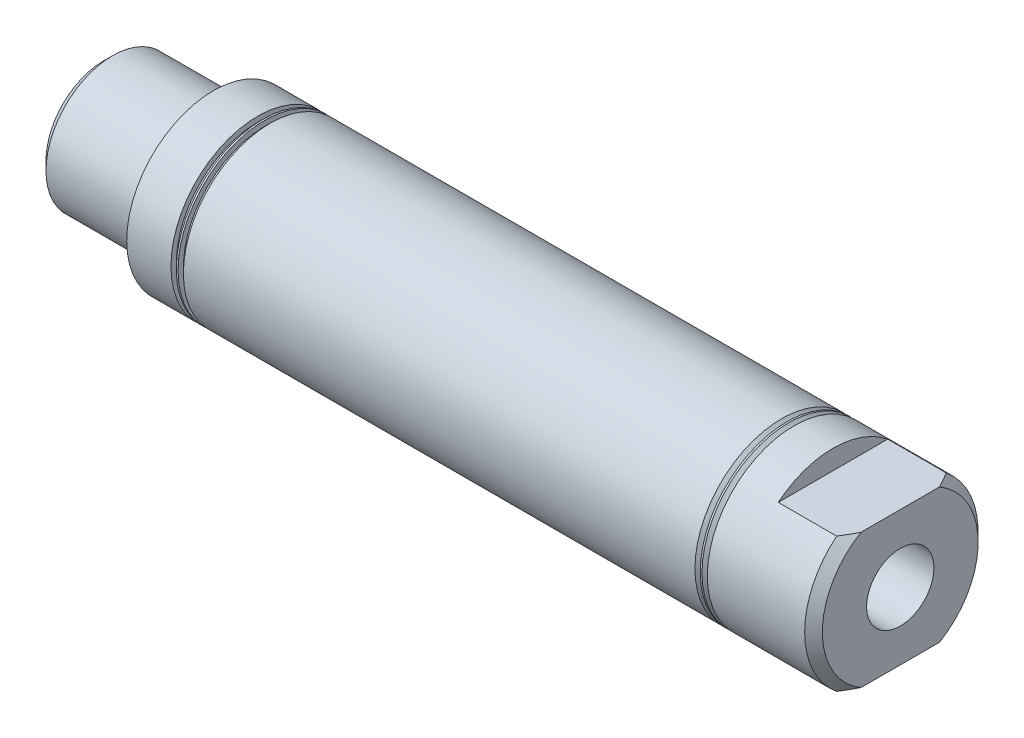
ISO-10303-21;
HEADER;
FILE_DESCRIPTION(('STEP AP214'),'2;1');
FILE_NAME('part.step','',(''),(''),'','','');
FILE_SCHEMA(('AUTOMOTIVE_DESIGN { 1 0 10303 214 1 1 1 1 }'));
ENDSEC;
DATA;
#1=APPLICATION_CONTEXT('core data for automotive mechanical design processes');
#2=APPLICATION_PROTOCOL_DEFINITION('international standard','automotive_design',2000,#1);
#3=PRODUCT_CONTEXT('',#1,'mechanical');
#4=PRODUCT('Part','Part','',(#3));
#5=PRODUCT_RELATED_PRODUCT_CATEGORY('part','',(#4));
#6=PRODUCT_DEFINITION_FORMATION('','',#4);
#7=PRODUCT_DEFINITION_CONTEXT('part definition',#1,'design');
#8=PRODUCT_DEFINITION('design','',#6,#7);
#9=PRODUCT_DEFINITION_SHAPE('','',#8);
#10=(LENGTH_UNIT() NAMED_UNIT(*) SI_UNIT(.MILLI.,.METRE.));
#11=(NAMED_UNIT(*) PLANE_ANGLE_UNIT() SI_UNIT($,.RADIAN.));
#12=(NAMED_UNIT(*) SI_UNIT($,.STERADIAN.) SOLID_ANGLE_UNIT());
#13=UNCERTAINTY_MEASURE_WITH_UNIT(LENGTH_MEASURE(1.E-05),#10,'distance_accuracy_value','');
#14=(GEOMETRIC_REPRESENTATION_CONTEXT(3) GLOBAL_UNCERTAINTY_ASSIGNED_CONTEXT((#13)) GLOBAL_UNIT_ASSIGNED_CONTEXT((#10,
#11,#12)) REPRESENTATION_CONTEXT('',''));
#15=CARTESIAN_POINT('',(0.,0.,0.));
#16=DIRECTION('',(0.,0.,1.));
#17=DIRECTION('',(1.,0.,0.));
#18=AXIS2_PLACEMENT_3D('',#15,#16,#17);
#19=CARTESIAN_POINT('',(0.,0.,0.));
#20=DIRECTION('',(1.,0.,0.));
#21=DIRECTION('',(0.,0.,-1.));
#22=AXIS2_PLACEMENT_3D('',#19,#20,#21);
#23=CYLINDRICAL_SURFACE('',#22,5.55625);
#24=CARTESIAN_POINT('',(19.812,0.,0.));
#25=DIRECTION('',(1.,0.,0.));
#26=DIRECTION('',(0.,0.,-1.));
#27=AXIS2_PLACEMENT_3D('',#24,#25,#26);
#28=CIRCLE('',#27,5.55625);
#29=CARTESIAN_POINT('',(19.812,0.,-5.55625));
#30=VERTEX_POINT('',#29);
#31=EDGE_CURVE('E219',#30,#30,#28,.F.);
#32=ORIENTED_EDGE('',*,*,#31,.T.);
#33=EDGE_LOOP('',(#32));
#34=FACE_BOUND('',#33,.T.);
#35=CARTESIAN_POINT('',(45.212,0.,0.));
#36=DIRECTION('',(1.,0.,0.));
#37=DIRECTION('',(0.,0.,-1.));
#38=AXIS2_PLACEMENT_3D('',#35,#36,#37);
#39=CIRCLE('',#38,5.55625);
#40=CARTESIAN_POINT('',(45.212,0.,-5.55625));
#41=VERTEX_POINT('',#40);
#42=EDGE_CURVE('E21',#41,#41,#39,.T.);
#43=ORIENTED_EDGE('',*,*,#42,.T.);
#44=EDGE_LOOP('',(#43));
#45=FACE_BOUND('',#44,.T.);
#46=ADVANCED_FACE('F18',(#34,#45),#23,.F.);
#47=CARTESIAN_POINT('',(45.212,0.,0.));
#48=DIRECTION('',(1.,0.,0.));
#49=DIRECTION('',(0.,0.,-1.));
#50=AXIS2_PLACEMENT_3D('',#47,#48,#49);
#51=PLANE('',#50);
#52=ORIENTED_EDGE('',*,*,#42,.F.);
#53=EDGE_LOOP('',(#52));
#54=FACE_BOUND('',#53,.T.);
#55=CARTESIAN_POINT('',(45.212,0.,0.));
#56=DIRECTION('',(1.,0.,0.));
#57=DIRECTION('',(0.,0.,-1.));
#58=AXIS2_PLACEMENT_3D('',#55,#56,#57);
#59=CIRCLE('',#58,2.0193);
#60=CARTESIAN_POINT('',(45.212,0.,-2.0193));
#61=VERTEX_POINT('',#60);
#62=EDGE_CURVE('E217',#61,#61,#59,.T.);
#63=ORIENTED_EDGE('',*,*,#62,.T.);
#64=EDGE_LOOP('',(#63));
#65=FACE_BOUND('',#64,.T.);
#66=ADVANCED_FACE('F227',(#54,#65),#51,.F.);
#67=CARTESIAN_POINT('',(19.812,5.55625,0.));
#68=DIRECTION('',(-1.,0.,0.));
#69=DIRECTION('',(0.,0.,1.));
#70=AXIS2_PLACEMENT_3D('',#67,#68,#69);
#71=PLANE('',#70);
#72=ORIENTED_EDGE('',*,*,#31,.F.);
#73=EDGE_LOOP('',(#72));
#74=FACE_BOUND('',#73,.T.);
#75=CARTESIAN_POINT('',(19.812,0.,0.));
#76=DIRECTION('',(1.,0.,0.));
#77=DIRECTION('',(0.,0.,-1.));
#78=AXIS2_PLACEMENT_3D('',#75,#76,#77);
#79=CIRCLE('',#78,2.3749);
#80=CARTESIAN_POINT('',(19.812,0.,-2.3749));
#81=VERTEX_POINT('',#80);
#82=EDGE_CURVE('E214',#81,#81,#79,.F.);
#83=ORIENTED_EDGE('',*,*,#82,.T.);
#84=EDGE_LOOP('',(#83));
#85=FACE_BOUND('',#84,.T.);
#86=ADVANCED_FACE('F230',(#74,#85),#71,.F.);
#87=CARTESIAN_POINT('',(57.15,0.,0.));
#88=DIRECTION('',(1.,0.,0.));
#89=DIRECTION('',(0.,0.,-1.));
#90=AXIS2_PLACEMENT_3D('',#87,#88,#89);
#91=CYLINDRICAL_SURFACE('',#90,2.0193);
#92=ORIENTED_EDGE('',*,*,#62,.F.);
#93=EDGE_LOOP('',(#92));
#94=FACE_BOUND('',#93,.T.);
#95=CARTESIAN_POINT('',(47.498,0.,0.));
#96=DIRECTION('',(1.,0.,0.));
#97=DIRECTION('',(0.,0.,-1.));
#98=AXIS2_PLACEMENT_3D('',#95,#96,#97);
#99=CIRCLE('',#98,2.0193);
#100=CARTESIAN_POINT('',(47.498,0.,-2.0193));
#101=VERTEX_POINT('',#100);
#102=EDGE_CURVE('E211',#101,#101,#99,.T.);
#103=ORIENTED_EDGE('',*,*,#102,.T.);
#104=EDGE_LOOP('',(#103));
#105=FACE_BOUND('',#104,.T.);
#106=ADVANCED_FACE('F233',(#94,#105),#91,.F.);
#107=CARTESIAN_POINT('',(0.,0.,0.));
#108=DIRECTION('',(1.,0.,0.));
#109=DIRECTION('',(0.,0.,-1.));
#110=AXIS2_PLACEMENT_3D('',#107,#108,#109);
#111=CYLINDRICAL_SURFACE('',#110,2.3749);
#112=CARTESIAN_POINT('',(0.,0.,0.));
#113=DIRECTION('',(1.,0.,0.));
#114=DIRECTION('',(0.,0.,-1.));
#115=AXIS2_PLACEMENT_3D('',#112,#113,#114);
#116=CIRCLE('',#115,2.3749);
#117=CARTESIAN_POINT('',(0.,0.,-2.3749));
#118=VERTEX_POINT('',#117);
#119=EDGE_CURVE('E208',#118,#118,#116,.F.);
#120=ORIENTED_EDGE('',*,*,#119,.T.);
#121=EDGE_LOOP('',(#120));
#122=FACE_BOUND('',#121,.T.);
#123=ORIENTED_EDGE('',*,*,#82,.F.);
#124=EDGE_LOOP('',(#123));
#125=FACE_BOUND('',#124,.T.);
#126=ADVANCED_FACE('F236',(#122,#125),#111,.F.);
#127=CARTESIAN_POINT('',(47.498,0.,2.0193));
#128=DIRECTION('',(-1.,0.,0.));
#129=DIRECTION('',(0.,0.,1.));
#130=AXIS2_PLACEMENT_3D('',#127,#128,#129);
#131=PLANE('',#130);
#132=CARTESIAN_POINT('',(47.498,0.,0.));
#133=DIRECTION('',(1.,0.,0.));
#134=DIRECTION('',(0.,0.,-1.));
#135=AXIS2_PLACEMENT_3D('',#132,#133,#134);
#136=CIRCLE('',#135,2.413);
#137=CARTESIAN_POINT('',(47.498,0.,-2.413));
#138=VERTEX_POINT('',#137);
#139=EDGE_CURVE('E205',#138,#138,#136,.T.);
#140=ORIENTED_EDGE('',*,*,#139,.T.);
#141=EDGE_LOOP('',(#140));
#142=FACE_BOUND('',#141,.T.);
#143=ORIENTED_EDGE('',*,*,#102,.F.);
#144=EDGE_LOOP('',(#143));
#145=FACE_BOUND('',#144,.T.);
#146=ADVANCED_FACE('F240',(#142,#145),#131,.F.);
#147=CARTESIAN_POINT('',(0.,4.7752,0.));
#148=DIRECTION('',(1.,0.,0.));
#149=DIRECTION('',(0.,0.,-1.));
#150=AXIS2_PLACEMENT_3D('',#147,#148,#149);
#151=PLANE('',#150);
#152=ORIENTED_EDGE('',*,*,#119,.F.);
#153=EDGE_LOOP('',(#152));
#154=FACE_BOUND('',#153,.T.);
#155=CARTESIAN_POINT('',(0.,0.,0.));
#156=DIRECTION('',(1.,0.,0.));
#157=DIRECTION('',(0.,0.,-1.));
#158=AXIS2_PLACEMENT_3D('',#155,#156,#157);
#159=CIRCLE('',#158,4.14019999999482);
#160=CARTESIAN_POINT('',(0.,0.,-4.14019999999482));
#161=VERTEX_POINT('',#160);
#162=EDGE_CURVE('E202',#161,#161,#159,.T.);
#163=ORIENTED_EDGE('',*,*,#162,.F.);
#164=EDGE_LOOP('',(#163));
#165=FACE_BOUND('',#164,.T.);
#166=ADVANCED_FACE('F242',(#154,#165),#151,.F.);
#167=CARTESIAN_POINT('',(57.15,0.,0.));
#168=DIRECTION('',(1.,0.,0.));
#169=DIRECTION('',(0.,0.,-1.));
#170=AXIS2_PLACEMENT_3D('',#167,#168,#169);
#171=CYLINDRICAL_SURFACE('',#170,2.413);
#172=ORIENTED_EDGE('',*,*,#139,.F.);
#173=EDGE_LOOP('',(#172));
#174=FACE_BOUND('',#173,.T.);
#175=CARTESIAN_POINT('',(57.15,0.,0.));
#176=DIRECTION('',(1.,0.,0.));
#177=DIRECTION('',(0.,0.,-1.));
#178=AXIS2_PLACEMENT_3D('',#175,#176,#177);
#179=CIRCLE('',#178,2.413);
#180=CARTESIAN_POINT('',(57.15,0.,-2.413));
#181=VERTEX_POINT('',#180);
#182=EDGE_CURVE('E118',#181,#181,#179,.T.);
#183=ORIENTED_EDGE('',*,*,#182,.T.);
#184=EDGE_LOOP('',(#183));
#185=FACE_BOUND('',#184,.T.);
#186=ADVANCED_FACE('F250',(#174,#185),#171,.F.);
#187=CARTESIAN_POINT('',(0.634999999931551,0.,0.));
#188=DIRECTION('',(1.,0.,0.));
#189=DIRECTION('',(0.,0.,-1.));
#190=AXIS2_PLACEMENT_3D('',#187,#188,#189);
#191=CONICAL_SURFACE('',#190,4.77519999998322,0.785398163442207);
#192=CARTESIAN_POINT('',(0.635000000000004,0.,0.));
#193=DIRECTION('',(-1.,0.,0.));
#194=DIRECTION('',(0.,0.,1.));
#195=AXIS2_PLACEMENT_3D('',#192,#193,#194);
#196=CIRCLE('',#195,4.7752);
#197=CARTESIAN_POINT('',(0.635000000000004,0.,4.7752));
#198=VERTEX_POINT('',#197);
#199=EDGE_CURVE('E112',#198,#198,#196,.F.);
#200=ORIENTED_EDGE('',*,*,#199,.F.);
#201=EDGE_LOOP('',(#200));
#202=FACE_BOUND('',#201,.T.);
#203=ORIENTED_EDGE('',*,*,#162,.T.);
#204=EDGE_LOOP('',(#203));
#205=FACE_BOUND('',#204,.T.);
#206=ADVANCED_FACE('F328',(#202,#205),#191,.T.);
#207=CARTESIAN_POINT('',(57.15,0.,0.));
#208=DIRECTION('',(-1.,0.,0.));
#209=DIRECTION('',(0.,0.,1.));
#210=AXIS2_PLACEMENT_3D('',#207,#208,#209);
#211=PLANE('',#210);
#212=CARTESIAN_POINT('',(57.1500000000356,0.,0.));
#213=DIRECTION('',(-1.,0.,0.));
#214=DIRECTION('',(0.,-1.,0.));
#215=AXIS2_PLACEMENT_3D('',#212,#213,#214);
#216=CIRCLE('',#215,5.58799999998882);
#217=CARTESIAN_POINT('',(57.1500000000178,4.826,-2.81699627264109));
#218=VERTEX_POINT('',#217);
#219=CARTESIAN_POINT('',(57.1500000000178,-4.826,-2.81699627264109));
#220=VERTEX_POINT('',#219);
#221=EDGE_CURVE('E107',#218,#220,#216,.T.);
#222=ORIENTED_EDGE('',*,*,#221,.F.);
#223=DIRECTION('',(0.,0.,1.));
#224=VECTOR('',#223,1.);
#225=CARTESIAN_POINT('',(57.15,4.826,3.92879790775753));
#226=LINE('',#225,#224);
#227=CARTESIAN_POINT('',(57.1500000000178,4.826,2.81699627264109));
#228=VERTEX_POINT('',#227);
#229=EDGE_CURVE('E104',#228,#218,#226,.F.);
#230=ORIENTED_EDGE('',*,*,#229,.F.);
#231=CARTESIAN_POINT('',(57.1500000000356,0.,0.));
#232=DIRECTION('',(-1.,0.,0.));
#233=DIRECTION('',(0.,-1.,0.));
#234=AXIS2_PLACEMENT_3D('',#231,#232,#233);
#235=CIRCLE('',#234,5.58799999998882);
#236=CARTESIAN_POINT('',(57.1500000000178,-4.826,2.81699627264109));
#237=VERTEX_POINT('',#236);
#238=EDGE_CURVE('E159',#237,#228,#235,.T.);
#239=ORIENTED_EDGE('',*,*,#238,.F.);
#240=DIRECTION('',(0.,0.,-1.));
#241=VECTOR('',#240,1.);
#242=CARTESIAN_POINT('',(57.15,-4.826,3.92879790775753));
#243=LINE('',#242,#241);
#244=EDGE_CURVE('E174',#220,#237,#243,.F.);
#245=ORIENTED_EDGE('',*,*,#244,.F.);
#246=EDGE_LOOP('',(#222,#230,#239,#245));
#247=FACE_BOUND('',#246,.T.);
#248=ORIENTED_EDGE('',*,*,#182,.F.);
#249=EDGE_LOOP('',(#248));
#250=FACE_BOUND('',#249,.T.);
#251=ADVANCED_FACE('F321',(#247,#250),#211,.F.);
#252=CARTESIAN_POINT('',(-21.4174471685587,0.,0.));
#253=DIRECTION('',(-1.,0.,0.));
#254=DIRECTION('',(0.,0.,1.));
#255=AXIS2_PLACEMENT_3D('',#252,#253,#254);
#256=CYLINDRICAL_SURFACE('',#255,4.7752);
#257=ORIENTED_EDGE('',*,*,#199,.T.);
#258=EDGE_LOOP('',(#257));
#259=FACE_BOUND('',#258,.T.);
#260=CARTESIAN_POINT('',(7.874,0.,0.));
#261=DIRECTION('',(-1.,0.,0.));
#262=DIRECTION('',(0.,0.,1.));
#263=AXIS2_PLACEMENT_3D('',#260,#261,#262);
#264=CIRCLE('',#263,4.7752);
#265=CARTESIAN_POINT('',(7.874,0.,4.7752));
#266=VERTEX_POINT('',#265);
#267=EDGE_CURVE('E115',#266,#266,#264,.T.);
#268=ORIENTED_EDGE('',*,*,#267,.T.);
#269=EDGE_LOOP('',(#268));
#270=FACE_BOUND('',#269,.T.);
#271=ADVANCED_FACE('F319',(#259,#270),#256,.T.);
#272=CARTESIAN_POINT('',(52.324,0.,0.));
#273=DIRECTION('',(-1.,0.,0.));
#274=DIRECTION('',(0.,0.,1.));
#275=AXIS2_PLACEMENT_3D('',#272,#273,#274);
#276=PLANE('',#275);
#277=DIRECTION('',(0.,0.,1.));
#278=VECTOR('',#277,1.);
#279=CARTESIAN_POINT('',(52.324,4.826,3.92879790775753));
#280=LINE('',#279,#278);
#281=CARTESIAN_POINT('',(52.324,4.826,-3.92879790775753));
#282=VERTEX_POINT('',#281);
#283=CARTESIAN_POINT('',(52.324,4.826,3.92879790775754));
#284=VERTEX_POINT('',#283);
#285=EDGE_CURVE('E72',#282,#284,#280,.T.);
#286=ORIENTED_EDGE('',*,*,#285,.F.);
#287=CARTESIAN_POINT('',(52.324,0.,0.));
#288=DIRECTION('',(-1.,0.,0.));
#289=DIRECTION('',(0.,0.,1.));
#290=AXIS2_PLACEMENT_3D('',#287,#288,#289);
#291=CIRCLE('',#290,6.223);
#292=EDGE_CURVE('E110',#284,#282,#291,.T.);
#293=ORIENTED_EDGE('',*,*,#292,.F.);
#294=EDGE_LOOP('',(#286,#293));
#295=FACE_BOUND('',#294,.T.);
#296=ADVANCED_FACE('F190',(#295),#276,.F.);
#297=CARTESIAN_POINT('',(52.324,4.826,3.92879790775753));
#298=DIRECTION('',(0.,1.,0.));
#299=DIRECTION('',(0.,0.,1.));
#300=AXIS2_PLACEMENT_3D('',#297,#298,#299);
#301=PLANE('',#300);
#302=ORIENTED_EDGE('',*,*,#229,.T.);
#303=CARTESIAN_POINT('',(56.5150000000143,4.826,-3.92879790777347));
#304=CARTESIAN_POINT('',(56.5719880631254,4.826,-3.83852088790234));
#305=CARTESIAN_POINT('',(56.628144310688,4.826,-3.74771204933027));
#306=CARTESIAN_POINT('',(56.7384954297001,4.826,-3.56498252078145));
#307=CARTESIAN_POINT('',(56.7926914067865,4.826,-3.47306249784289));
#308=CARTESIAN_POINT('',(56.8988952952398,4.826,-3.28795020580894));
#309=CARTESIAN_POINT('',(56.9509029948933,4.826,-3.19475781476335));
#310=CARTESIAN_POINT('',(57.05241918421,4.826,-3.00695423575408));
#311=CARTESIAN_POINT('',(57.1019262225962,4.826,-2.91234226431309));
#312=CARTESIAN_POINT('',(57.1500000000232,4.826,-2.81699627263028));
#313=B_SPLINE_CURVE_WITH_KNOTS('',3,(#303,#304,#305,#306,#307,#308,#309,#310,#311,#312),
.UNSPECIFIED.,.F.,.F.,(4,2,2,2,4),(0.,0.320281931511795,0.640380306665256,0.960509580095834,
1.28082255709992),.UNSPECIFIED.);
#314=CARTESIAN_POINT('',(56.5150000000072,4.826,-3.9287979077655));
#315=VERTEX_POINT('',#314);
#316=EDGE_CURVE('E88',#315,#218,#313,.T.);
#317=ORIENTED_EDGE('',*,*,#316,.F.);
#318=DIRECTION('',(-1.,0.,0.));
#319=VECTOR('',#318,1.);
#320=CARTESIAN_POINT('',(-21.4174471685587,4.826,-3.92879790775753));
#321=LINE('',#320,#319);
#322=EDGE_CURVE('E98',#282,#315,#321,.F.);
#323=ORIENTED_EDGE('',*,*,#322,.F.);
#324=ORIENTED_EDGE('',*,*,#285,.T.);
#325=DIRECTION('',(-1.,0.,0.));
#326=VECTOR('',#325,1.);
#327=CARTESIAN_POINT('',(-21.4174471685587,4.826,3.92879790775754));
#328=LINE('',#327,#326);
#329=CARTESIAN_POINT('',(56.5150000000087,4.826,3.92879790776304));
#330=VERTEX_POINT('',#329);
#331=EDGE_CURVE('E113',#330,#284,#328,.T.);
#332=ORIENTED_EDGE('',*,*,#331,.F.);
#333=CARTESIAN_POINT('',(56.515000000015,4.82599999999472,3.92879790776702));
#334=CARTESIAN_POINT('',(56.5719880631271,4.82599999999809,3.83852088789754));
#335=CARTESIAN_POINT('',(56.6281443106899,4.82599999999949,3.74771204932657));
#336=CARTESIAN_POINT('',(56.7384954297016,4.82600000000051,3.56498252077947));
#337=CARTESIAN_POINT('',(56.7926914067874,4.82600000000015,3.47306249784154));
#338=CARTESIAN_POINT('',(56.8988952952397,4.82599999999985,3.28795020580899));
#339=CARTESIAN_POINT('',(56.9509029948928,4.82599999999993,3.19475781476418));
#340=CARTESIAN_POINT('',(57.0524191842088,4.82600000000007,3.0069542357565));
#341=CARTESIAN_POINT('',(57.1019262225946,4.82600000000015,2.91234226431631));
#342=CARTESIAN_POINT('',(57.1500000000212,4.826,2.81699627263425));
#343=B_SPLINE_CURVE_WITH_KNOTS('',3,(#333,#334,#335,#336,#337,#338,#339,#340,#341,#342),
.UNSPECIFIED.,.F.,.F.,(4,2,2,2,4),(0.,0.320281931509256,0.640380306660151,0.960509580088117,
1.28082255708962),.UNSPECIFIED.);
#344=EDGE_CURVE('E108',#330,#228,#343,.T.);
#345=ORIENTED_EDGE('',*,*,#344,.T.);
#346=EDGE_LOOP('',(#302,#317,#323,#324,#332,#345));
#347=FACE_BOUND('',#346,.T.);
#348=ADVANCED_FACE('F184',(#347),#301,.T.);
#349=CARTESIAN_POINT('',(56.5149999999903,0.,0.));
#350=DIRECTION('',(-1.,0.,0.));
#351=DIRECTION('',(0.,-1.,0.));
#352=AXIS2_PLACEMENT_3D('',#349,#350,#351);
#353=CONICAL_SURFACE('',#352,6.22300000003406,0.785398163397448);
#354=CARTESIAN_POINT('',(56.515,0.,0.));
#355=DIRECTION('',(-1.,0.,0.));
#356=DIRECTION('',(0.,0.,1.));
#357=AXIS2_PLACEMENT_3D('',#354,#355,#356);
#358=CIRCLE('',#357,6.223);
#359=CARTESIAN_POINT('',(56.5150000000087,-4.826,-3.92879790776304));
#360=VERTEX_POINT('',#359);
#361=EDGE_CURVE('E96',#315,#360,#358,.T.);
#362=ORIENTED_EDGE('',*,*,#361,.F.);
#363=ORIENTED_EDGE('',*,*,#316,.T.);
#364=ORIENTED_EDGE('',*,*,#221,.T.);
#365=CARTESIAN_POINT('',(56.515000000015,-4.82599999999472,-3.92879790776702));
#366=CARTESIAN_POINT('',(56.5719880631271,-4.82599999999809,-3.83852088789754));
#367=CARTESIAN_POINT('',(56.6281443106899,-4.82599999999949,-3.74771204932657));
#368=CARTESIAN_POINT('',(56.7384954297016,-4.82600000000051,-3.56498252077947));
#369=CARTESIAN_POINT('',(56.7926914067874,-4.82600000000015,-3.47306249784154));
#370=CARTESIAN_POINT('',(56.8988952952397,-4.82599999999985,-3.28795020580899));
#371=CARTESIAN_POINT('',(56.9509029948928,-4.82599999999993,-3.19475781476418));
#372=CARTESIAN_POINT('',(57.0524191842088,-4.82600000000007,-3.00695423575649));
#373=CARTESIAN_POINT('',(57.1019262225946,-4.82600000000015,-2.91234226431631));
#374=CARTESIAN_POINT('',(57.1500000000212,-4.826,-2.81699627263425));
#375=B_SPLINE_CURVE_WITH_KNOTS('',3,(#365,#366,#367,#368,#369,#370,#371,#372,#373,#374),
.UNSPECIFIED.,.F.,.F.,(4,2,2,2,4),(0.,0.320281931509256,0.640380306660155,0.960509580088126,
1.28082255708962),.UNSPECIFIED.);
#376=EDGE_CURVE('E87',#360,#220,#375,.T.);
#377=ORIENTED_EDGE('',*,*,#376,.F.);
#378=EDGE_LOOP('',(#362,#363,#364,#377));
#379=FACE_BOUND('',#378,.T.);
#380=ADVANCED_FACE('F181',(#379),#353,.T.);
#381=CARTESIAN_POINT('',(52.324,0.,0.));
#382=DIRECTION('',(-1.,0.,0.));
#383=DIRECTION('',(0.,0.,1.));
#384=AXIS2_PLACEMENT_3D('',#381,#382,#383);
#385=PLANE('',#384);
#386=DIRECTION('',(0.,0.,-1.));
#387=VECTOR('',#386,1.);
#388=CARTESIAN_POINT('',(52.324,-4.826,3.92879790775753));
#389=LINE('',#388,#387);
#390=CARTESIAN_POINT('',(52.324,-4.826,3.92879790775753));
#391=VERTEX_POINT('',#390);
#392=CARTESIAN_POINT('',(52.324,-4.826,-3.92879790775753));
#393=VERTEX_POINT('',#392);
#394=EDGE_CURVE('E77',#391,#393,#389,.T.);
#395=ORIENTED_EDGE('',*,*,#394,.F.);
#396=CARTESIAN_POINT('',(52.324,0.,0.));
#397=DIRECTION('',(-1.,0.,0.));
#398=DIRECTION('',(0.,0.,1.));
#399=AXIS2_PLACEMENT_3D('',#396,#397,#398);
#400=CIRCLE('',#399,6.223);
#401=EDGE_CURVE('E90',#393,#391,#400,.T.);
#402=ORIENTED_EDGE('',*,*,#401,.F.);
#403=EDGE_LOOP('',(#395,#402));
#404=FACE_BOUND('',#403,.T.);
#405=ADVANCED_FACE('F91',(#404),#385,.F.);
#406=CARTESIAN_POINT('',(52.324,-4.826,3.92879790775753));
#407=DIRECTION('',(0.,-1.,0.));
#408=DIRECTION('',(0.,0.,-1.));
#409=AXIS2_PLACEMENT_3D('',#406,#407,#408);
#410=PLANE('',#409);
#411=ORIENTED_EDGE('',*,*,#244,.T.);
#412=CARTESIAN_POINT('',(56.5150000000143,-4.826,3.92879790777347));
#413=CARTESIAN_POINT('',(56.5719880631254,-4.826,3.83852088790234));
#414=CARTESIAN_POINT('',(56.628144310688,-4.826,3.74771204933027));
#415=CARTESIAN_POINT('',(56.7384954297001,-4.826,3.56498252078145));
#416=CARTESIAN_POINT('',(56.7926914067865,-4.826,3.47306249784289));
#417=CARTESIAN_POINT('',(56.8988952952398,-4.826,3.28795020580893));
#418=CARTESIAN_POINT('',(56.9509029948933,-4.826,3.19475781476334));
#419=CARTESIAN_POINT('',(57.05241918421,-4.826,3.00695423575407));
#420=CARTESIAN_POINT('',(57.1019262225962,-4.826,2.91234226431309));
#421=CARTESIAN_POINT('',(57.1500000000232,-4.826,2.81699627263028));
#422=B_SPLINE_CURVE_WITH_KNOTS('',3,(#412,#413,#414,#415,#416,#417,#418,#419,#420,#421),
.UNSPECIFIED.,.F.,.F.,(4,2,2,2,4),(0.,0.320281931511797,0.640380306665263,0.960509580095844,
1.28082255709993),.UNSPECIFIED.);
#423=CARTESIAN_POINT('',(56.5150000000072,-4.826,3.9287979077655));
#424=VERTEX_POINT('',#423);
#425=EDGE_CURVE('E36',#424,#237,#422,.T.);
#426=ORIENTED_EDGE('',*,*,#425,.F.);
#427=DIRECTION('',(-1.,0.,0.));
#428=VECTOR('',#427,1.);
#429=CARTESIAN_POINT('',(-21.4174471685587,-4.826,3.92879790775753));
#430=LINE('',#429,#428);
#431=EDGE_CURVE('E84',#391,#424,#430,.F.);
#432=ORIENTED_EDGE('',*,*,#431,.F.);
#433=ORIENTED_EDGE('',*,*,#394,.T.);
#434=DIRECTION('',(-1.,0.,0.));
#435=VECTOR('',#434,1.);
#436=CARTESIAN_POINT('',(-21.4174471685587,-4.826,-3.92879790775753));
#437=LINE('',#436,#435);
#438=EDGE_CURVE('E82',#360,#393,#437,.T.);
#439=ORIENTED_EDGE('',*,*,#438,.F.);
#440=ORIENTED_EDGE('',*,*,#376,.T.);
#441=EDGE_LOOP('',(#411,#426,#432,#433,#439,#440));
#442=FACE_BOUND('',#441,.T.);
#443=ADVANCED_FACE('F79',(#442),#410,.T.);
#444=CARTESIAN_POINT('',(56.5149999999903,0.,0.));
#445=DIRECTION('',(-1.,0.,0.));
#446=DIRECTION('',(0.,-1.,0.));
#447=AXIS2_PLACEMENT_3D('',#444,#445,#446);
#448=CONICAL_SURFACE('',#447,6.22300000003406,0.785398163397448);
#449=CARTESIAN_POINT('',(56.515,0.,0.));
#450=DIRECTION('',(-1.,0.,0.));
#451=DIRECTION('',(0.,0.,1.));
#452=AXIS2_PLACEMENT_3D('',#449,#450,#451);
#453=CIRCLE('',#452,6.223);
#454=EDGE_CURVE('E65',#424,#330,#453,.T.);
#455=ORIENTED_EDGE('',*,*,#454,.F.);
#456=ORIENTED_EDGE('',*,*,#425,.T.);
#457=ORIENTED_EDGE('',*,*,#238,.T.);
#458=ORIENTED_EDGE('',*,*,#344,.F.);
#459=EDGE_LOOP('',(#455,#456,#457,#458));
#460=FACE_BOUND('',#459,.T.);
#461=ADVANCED_FACE('F161',(#460),#448,.T.);
#462=CARTESIAN_POINT('',(7.874,6.223,0.));
#463=DIRECTION('',(1.,0.,0.));
#464=DIRECTION('',(0.,0.,-1.));
#465=AXIS2_PLACEMENT_3D('',#462,#463,#464);
#466=PLANE('',#465);
#467=CARTESIAN_POINT('',(7.874,0.,0.));
#468=DIRECTION('',(-1.,0.,0.));
#469=DIRECTION('',(0.,0.,1.));
#470=AXIS2_PLACEMENT_3D('',#467,#468,#469);
#471=CIRCLE('',#470,6.223);
#472=CARTESIAN_POINT('',(7.874,0.,6.223));
#473=VERTEX_POINT('',#472);
#474=EDGE_CURVE('E145',#473,#473,#471,.F.);
#475=ORIENTED_EDGE('',*,*,#474,.F.);
#476=EDGE_LOOP('',(#475));
#477=FACE_BOUND('',#476,.T.);
#478=ORIENTED_EDGE('',*,*,#267,.F.);
#479=EDGE_LOOP('',(#478));
#480=FACE_BOUND('',#479,.T.);
#481=ADVANCED_FACE('F308',(#477,#480),#466,.F.);
#482=CARTESIAN_POINT('',(-21.4174471685587,0.,0.));
#483=DIRECTION('',(-1.,0.,0.));
#484=DIRECTION('',(0.,0.,1.));
#485=AXIS2_PLACEMENT_3D('',#482,#483,#484);
#486=CYLINDRICAL_SURFACE('',#485,6.223);
#487=ORIENTED_EDGE('',*,*,#322,.T.);
#488=ORIENTED_EDGE('',*,*,#361,.T.);
#489=ORIENTED_EDGE('',*,*,#438,.T.);
#490=ORIENTED_EDGE('',*,*,#401,.T.);
#491=ORIENTED_EDGE('',*,*,#431,.T.);
#492=ORIENTED_EDGE('',*,*,#454,.T.);
#493=ORIENTED_EDGE('',*,*,#331,.T.);
#494=ORIENTED_EDGE('',*,*,#292,.T.);
#495=EDGE_LOOP('',(#487,#488,#489,#490,#491,#492,#493,#494));
#496=FACE_BOUND('',#495,.T.);
#497=CARTESIAN_POINT('',(49.53,0.,0.));
#498=DIRECTION('',(-1.,0.,0.));
#499=DIRECTION('',(0.,0.,1.));
#500=AXIS2_PLACEMENT_3D('',#497,#498,#499);
#501=CIRCLE('',#500,6.223);
#502=CARTESIAN_POINT('',(49.53,0.,6.223));
#503=VERTEX_POINT('',#502);
#504=EDGE_CURVE('E142',#503,#503,#501,.T.);
#505=ORIENTED_EDGE('',*,*,#504,.F.);
#506=EDGE_LOOP('',(#505));
#507=FACE_BOUND('',#506,.T.);
#508=ADVANCED_FACE('F94',(#496,#507),#486,.T.);
#509=CARTESIAN_POINT('',(-21.4174471685587,0.,0.));
#510=DIRECTION('',(-1.,0.,0.));
#511=DIRECTION('',(0.,0.,1.));
#512=AXIS2_PLACEMENT_3D('',#509,#510,#511);
#513=CYLINDRICAL_SURFACE('',#512,6.223);
#514=CARTESIAN_POINT('',(11.049,0.,0.));
#515=DIRECTION('',(-1.,0.,0.));
#516=DIRECTION('',(0.,0.,1.));
#517=AXIS2_PLACEMENT_3D('',#514,#515,#516);
#518=CIRCLE('',#517,6.223);
#519=CARTESIAN_POINT('',(11.049,0.,6.223));
#520=VERTEX_POINT('',#519);
#521=EDGE_CURVE('E139',#520,#520,#518,.F.);
#522=ORIENTED_EDGE('',*,*,#521,.F.);
#523=EDGE_LOOP('',(#522));
#524=FACE_BOUND('',#523,.T.);
#525=ORIENTED_EDGE('',*,*,#474,.T.);
#526=EDGE_LOOP('',(#525));
#527=FACE_BOUND('',#526,.T.);
#528=ADVANCED_FACE('F302',(#524,#527),#513,.T.);
#529=CARTESIAN_POINT('',(49.53,6.223,0.));
#530=DIRECTION('',(-1.,0.,0.));
#531=DIRECTION('',(0.,0.,1.));
#532=AXIS2_PLACEMENT_3D('',#529,#530,#531);
#533=PLANE('',#532);
#534=CARTESIAN_POINT('',(49.5299999999474,0.,0.));
#535=DIRECTION('',(-1.,0.,0.));
#536=DIRECTION('',(0.,0.,1.));
#537=AXIS2_PLACEMENT_3D('',#534,#535,#536);
#538=CIRCLE('',#537,5.84200000002966);
#539=CARTESIAN_POINT('',(49.5299999999474,0.,5.84200000002966));
#540=VERTEX_POINT('',#539);
#541=EDGE_CURVE('E136',#540,#540,#538,.T.);
#542=ORIENTED_EDGE('',*,*,#541,.F.);
#543=EDGE_LOOP('',(#542));
#544=FACE_BOUND('',#543,.T.);
#545=ORIENTED_EDGE('',*,*,#504,.T.);
#546=EDGE_LOOP('',(#545));
#547=FACE_BOUND('',#546,.T.);
#548=ADVANCED_FACE('F298',(#544,#547),#533,.T.);
#549=CARTESIAN_POINT('',(11.049,6.223,0.));
#550=DIRECTION('',(1.,0.,0.));
#551=DIRECTION('',(0.,0.,-1.));
#552=AXIS2_PLACEMENT_3D('',#549,#550,#551);
#553=PLANE('',#552);
#554=ORIENTED_EDGE('',*,*,#521,.T.);
#555=EDGE_LOOP('',(#554));
#556=FACE_BOUND('',#555,.T.);
#557=CARTESIAN_POINT('',(11.0490000000141,0.,0.));
#558=DIRECTION('',(1.,0.,0.));
#559=DIRECTION('',(0.,0.,-1.));
#560=AXIS2_PLACEMENT_3D('',#557,#558,#559);
#561=CIRCLE('',#560,5.84199999997281);
#562=CARTESIAN_POINT('',(11.0490000000141,0.,-5.84199999997281));
#563=VERTEX_POINT('',#562);
#564=EDGE_CURVE('E132',#563,#563,#561,.T.);
#565=ORIENTED_EDGE('',*,*,#564,.F.);
#566=EDGE_LOOP('',(#565));
#567=FACE_BOUND('',#566,.T.);
#568=ADVANCED_FACE('F294',(#556,#567),#553,.T.);
#569=CARTESIAN_POINT('',(49.1490000000567,0.,0.));
#570=DIRECTION('',(-1.,0.,0.));
#571=DIRECTION('',(0.,0.,1.));
#572=AXIS2_PLACEMENT_3D('',#569,#570,#571);
#573=CONICAL_SURFACE('',#572,6.22299999992038,0.785398163397448);
#574=ORIENTED_EDGE('',*,*,#541,.T.);
#575=EDGE_LOOP('',(#574));
#576=FACE_BOUND('',#575,.T.);
#577=CARTESIAN_POINT('',(49.149,0.,0.));
#578=DIRECTION('',(-1.,0.,0.));
#579=DIRECTION('',(0.,0.,1.));
#580=AXIS2_PLACEMENT_3D('',#577,#578,#579);
#581=CIRCLE('',#580,6.223);
#582=CARTESIAN_POINT('',(49.149,0.,6.223));
#583=VERTEX_POINT('',#582);
#584=EDGE_CURVE('E135',#583,#583,#581,.T.);
#585=ORIENTED_EDGE('',*,*,#584,.F.);
#586=EDGE_LOOP('',(#585));
#587=FACE_BOUND('',#586,.T.);
#588=ADVANCED_FACE('F290',(#576,#587),#573,.T.);
#589=CARTESIAN_POINT('',(11.4299999999616,0.,0.));
#590=DIRECTION('',(1.,0.,0.));
#591=DIRECTION('',(0.,0.,-1.));
#592=AXIS2_PLACEMENT_3D('',#589,#590,#591);
#593=CONICAL_SURFACE('',#592,6.22299999997722,0.785398163472046);
#594=ORIENTED_EDGE('',*,*,#564,.T.);
#595=EDGE_LOOP('',(#594));
#596=FACE_BOUND('',#595,.T.);
#597=CARTESIAN_POINT('',(11.43,0.,0.));
#598=DIRECTION('',(-1.,0.,0.));
#599=DIRECTION('',(0.,0.,1.));
#600=AXIS2_PLACEMENT_3D('',#597,#598,#599);
#601=CIRCLE('',#600,6.223);
#602=CARTESIAN_POINT('',(11.43,0.,6.223));
#603=VERTEX_POINT('',#602);
#604=EDGE_CURVE('E131',#603,#603,#601,.F.);
#605=ORIENTED_EDGE('',*,*,#604,.F.);
#606=EDGE_LOOP('',(#605));
#607=FACE_BOUND('',#606,.T.);
#608=ADVANCED_FACE('F286',(#596,#607),#593,.T.);
#609=CARTESIAN_POINT('',(-21.4174471685587,0.,0.));
#610=DIRECTION('',(-1.,0.,0.));
#611=DIRECTION('',(0.,0.,1.));
#612=AXIS2_PLACEMENT_3D('',#609,#610,#611);
#613=CYLINDRICAL_SURFACE('',#612,6.223);
#614=ORIENTED_EDGE('',*,*,#584,.T.);
#615=EDGE_LOOP('',(#614));
#616=FACE_BOUND('',#615,.T.);
#617=CARTESIAN_POINT('',(49.022,0.,0.));
#618=DIRECTION('',(-1.,0.,0.));
#619=DIRECTION('',(0.,0.,1.));
#620=AXIS2_PLACEMENT_3D('',#617,#618,#619);
#621=CIRCLE('',#620,6.223);
#622=CARTESIAN_POINT('',(49.022,0.,6.223));
#623=VERTEX_POINT('',#622);
#624=EDGE_CURVE('E128',#623,#623,#621,.T.);
#625=ORIENTED_EDGE('',*,*,#624,.F.);
#626=EDGE_LOOP('',(#625));
#627=FACE_BOUND('',#626,.T.);
#628=ADVANCED_FACE('F282',(#616,#627),#613,.T.);
#629=CARTESIAN_POINT('',(-21.4174471685587,0.,0.));
#630=DIRECTION('',(-1.,0.,0.));
#631=DIRECTION('',(0.,0.,1.));
#632=AXIS2_PLACEMENT_3D('',#629,#630,#631);
#633=CYLINDRICAL_SURFACE('',#632,6.223);
#634=CARTESIAN_POINT('',(11.557,0.,0.));
#635=DIRECTION('',(-1.,0.,0.));
#636=DIRECTION('',(0.,0.,1.));
#637=AXIS2_PLACEMENT_3D('',#634,#635,#636);
#638=CIRCLE('',#637,6.223);
#639=CARTESIAN_POINT('',(11.557,0.,6.223));
#640=VERTEX_POINT('',#639);
#641=EDGE_CURVE('E125',#640,#640,#638,.F.);
#642=ORIENTED_EDGE('',*,*,#641,.F.);
#643=EDGE_LOOP('',(#642));
#644=FACE_BOUND('',#643,.T.);
#645=ORIENTED_EDGE('',*,*,#604,.T.);
#646=EDGE_LOOP('',(#645));
#647=FACE_BOUND('',#646,.T.);
#648=ADVANCED_FACE('F278',(#644,#647),#633,.T.);
#649=CARTESIAN_POINT('',(49.022,6.223,0.));
#650=DIRECTION('',(-1.,0.,0.));
#651=DIRECTION('',(0.,0.,1.));
#652=AXIS2_PLACEMENT_3D('',#649,#650,#651);
#653=PLANE('',#652);
#654=CARTESIAN_POINT('',(49.0219999998658,0.,0.));
#655=DIRECTION('',(-1.,0.,0.));
#656=DIRECTION('',(0.,-1.,0.));
#657=AXIS2_PLACEMENT_3D('',#654,#655,#656);
#658=CIRCLE('',#657,5.84200000002966);
#659=CARTESIAN_POINT('',(49.0219999998658,-5.84200000002966,0.));
#660=VERTEX_POINT('',#659);
#661=EDGE_CURVE('E122',#660,#660,#658,.T.);
#662=ORIENTED_EDGE('',*,*,#661,.F.);
#663=EDGE_LOOP('',(#662));
#664=FACE_BOUND('',#663,.T.);
#665=ORIENTED_EDGE('',*,*,#624,.T.);
#666=EDGE_LOOP('',(#665));
#667=FACE_BOUND('',#666,.T.);
#668=ADVANCED_FACE('F274',(#664,#667),#653,.T.);
#669=CARTESIAN_POINT('',(11.557,6.223,0.));
#670=DIRECTION('',(1.,0.,0.));
#671=DIRECTION('',(0.,0.,-1.));
#672=AXIS2_PLACEMENT_3D('',#669,#670,#671);
#673=PLANE('',#672);
#674=ORIENTED_EDGE('',*,*,#641,.T.);
#675=EDGE_LOOP('',(#674));
#676=FACE_BOUND('',#675,.T.);
#677=CARTESIAN_POINT('',(11.5569999999821,0.,0.));
#678=DIRECTION('',(1.,0.,0.));
#679=DIRECTION('',(0.,0.,-1.));
#680=AXIS2_PLACEMENT_3D('',#677,#678,#679);
#681=CIRCLE('',#680,5.84199999997281);
#682=CARTESIAN_POINT('',(11.5569999999821,0.,-5.84199999997281));
#683=VERTEX_POINT('',#682);
#684=EDGE_CURVE('E119',#683,#683,#681,.T.);
#685=ORIENTED_EDGE('',*,*,#684,.F.);
#686=EDGE_LOOP('',(#685));
#687=FACE_BOUND('',#686,.T.);
#688=ADVANCED_FACE('F270',(#676,#687),#673,.T.);
#689=CARTESIAN_POINT('',(48.6410000000888,0.,0.));
#690=DIRECTION('',(-1.,0.,0.));
#691=DIRECTION('',(0.,-1.,0.));
#692=AXIS2_PLACEMENT_3D('',#689,#690,#691);
#693=CONICAL_SURFACE('',#692,6.22299999980669,0.785398163397448);
#694=CARTESIAN_POINT('',(48.641,0.,0.));
#695=DIRECTION('',(-1.,0.,0.));
#696=DIRECTION('',(0.,0.,1.));
#697=AXIS2_PLACEMENT_3D('',#694,#695,#696);
#698=CIRCLE('',#697,6.223);
#699=CARTESIAN_POINT('',(48.641,0.,6.223));
#700=VERTEX_POINT('',#699);
#701=EDGE_CURVE('E27',#700,#700,#698,.T.);
#702=ORIENTED_EDGE('',*,*,#701,.F.);
#703=EDGE_LOOP('',(#702));
#704=FACE_BOUND('',#703,.T.);
#705=ORIENTED_EDGE('',*,*,#661,.T.);
#706=EDGE_LOOP('',(#705));
#707=FACE_BOUND('',#706,.T.);
#708=ADVANCED_FACE('F263',(#704,#707),#693,.T.);
#709=CARTESIAN_POINT('',(11.9379999998728,0.,0.));
#710=DIRECTION('',(1.,0.,0.));
#711=DIRECTION('',(0.,0.,-1.));
#712=AXIS2_PLACEMENT_3D('',#709,#710,#711);
#713=CONICAL_SURFACE('',#712,6.22299999986353,0.785398163397448);
#714=CARTESIAN_POINT('',(11.938,0.,0.));
#715=DIRECTION('',(-1.,0.,0.));
#716=DIRECTION('',(0.,0.,1.));
#717=AXIS2_PLACEMENT_3D('',#714,#715,#716);
#718=CIRCLE('',#717,6.223);
#719=CARTESIAN_POINT('',(11.938,0.,6.223));
#720=VERTEX_POINT('',#719);
#721=EDGE_CURVE('E11',#720,#720,#718,.F.);
#722=ORIENTED_EDGE('',*,*,#721,.F.);
#723=EDGE_LOOP('',(#722));
#724=FACE_BOUND('',#723,.T.);
#725=ORIENTED_EDGE('',*,*,#684,.T.);
#726=EDGE_LOOP('',(#725));
#727=FACE_BOUND('',#726,.T.);
#728=ADVANCED_FACE('F257',(#724,#727),#713,.T.);
#729=CARTESIAN_POINT('',(-21.4174471685587,0.,0.));
#730=DIRECTION('',(-1.,0.,0.));
#731=DIRECTION('',(0.,0.,1.));
#732=AXIS2_PLACEMENT_3D('',#729,#730,#731);
#733=CYLINDRICAL_SURFACE('',#732,6.223);
#734=ORIENTED_EDGE('',*,*,#721,.T.);
#735=EDGE_LOOP('',(#734));
#736=FACE_BOUND('',#735,.T.);
#737=ORIENTED_EDGE('',*,*,#701,.T.);
#738=EDGE_LOOP('',(#737));
#739=FACE_BOUND('',#738,.T.);
#740=ADVANCED_FACE('F255',(#736,#739),#733,.T.);
#741=CLOSED_SHELL('',(#46,#66,#86,#106,#126,#146,#166,#186,#206,#251,#271,#296,#348,#380,#405,
#443,#461,#481,#508,#528,#548,#568,#588,#608,#628,#648,#668,#688,#708,#728,#740));
#742=MANIFOLD_SOLID_BREP('B1',#741);
#743=ADVANCED_BREP_SHAPE_REPRESENTATION('',(#18,#742),#14);
#744=SHAPE_DEFINITION_REPRESENTATION(#9,#743);
ENDSEC;
END-ISO-10303-21;
